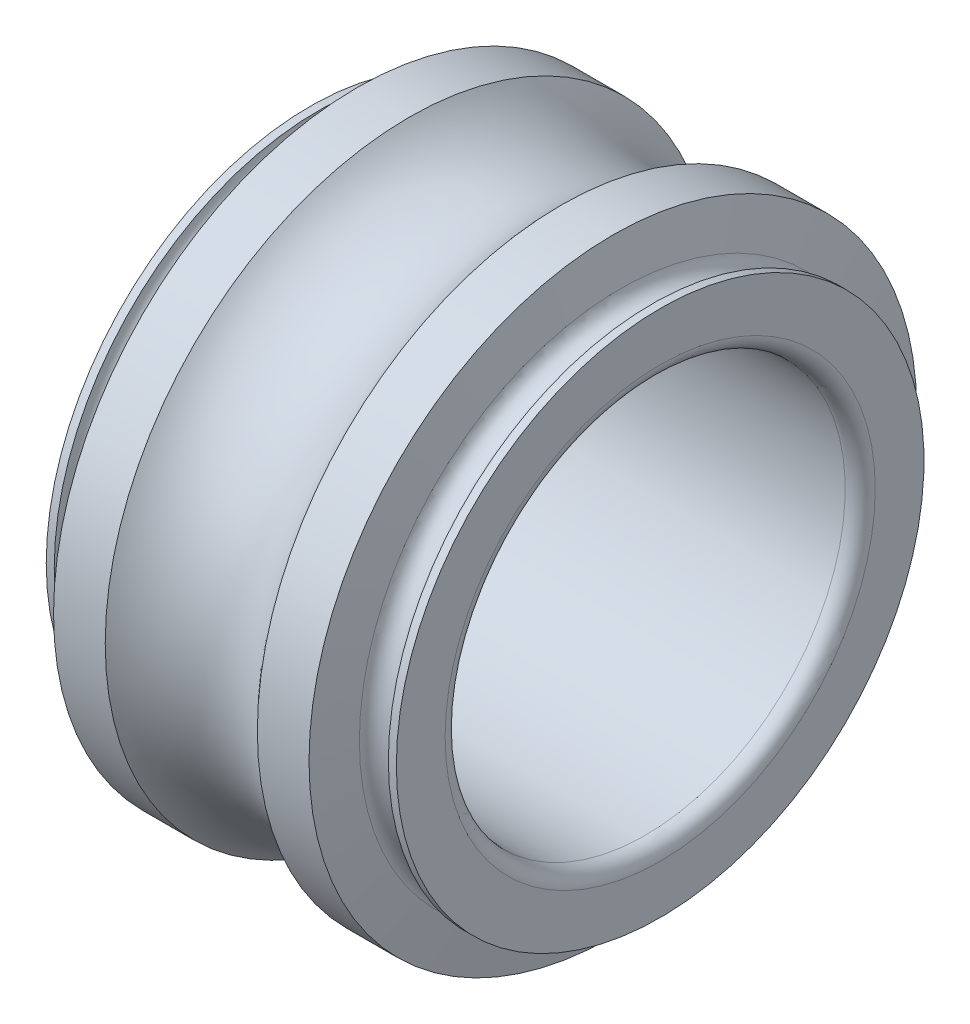
ISO-10303-21;
HEADER;
FILE_DESCRIPTION(('STEP AP214'),'2;1');
FILE_NAME('part.step','',(''),(''),'','','');
FILE_SCHEMA(('AUTOMOTIVE_DESIGN { 1 0 10303 214 1 1 1 1 }'));
ENDSEC;
DATA;
#1=APPLICATION_CONTEXT('core data for automotive mechanical design processes');
#2=APPLICATION_PROTOCOL_DEFINITION('international standard','automotive_design',2000,#1);
#3=PRODUCT_CONTEXT('',#1,'mechanical');
#4=PRODUCT('Part','Part','',(#3));
#5=PRODUCT_RELATED_PRODUCT_CATEGORY('part','',(#4));
#6=PRODUCT_DEFINITION_FORMATION('','',#4);
#7=PRODUCT_DEFINITION_CONTEXT('part definition',#1,'design');
#8=PRODUCT_DEFINITION('design','',#6,#7);
#9=PRODUCT_DEFINITION_SHAPE('','',#8);
#10=(LENGTH_UNIT() NAMED_UNIT(*) SI_UNIT(.MILLI.,.METRE.));
#11=(NAMED_UNIT(*) PLANE_ANGLE_UNIT() SI_UNIT($,.RADIAN.));
#12=(NAMED_UNIT(*) SI_UNIT($,.STERADIAN.) SOLID_ANGLE_UNIT());
#13=UNCERTAINTY_MEASURE_WITH_UNIT(LENGTH_MEASURE(1.E-05),#10,'distance_accuracy_value','');
#14=(GEOMETRIC_REPRESENTATION_CONTEXT(3) GLOBAL_UNCERTAINTY_ASSIGNED_CONTEXT((#13)) GLOBAL_UNIT_ASSIGNED_CONTEXT((#10,
#11,#12)) REPRESENTATION_CONTEXT('',''));
#15=CARTESIAN_POINT('',(0.,0.,0.));
#16=DIRECTION('',(0.,0.,1.));
#17=DIRECTION('',(1.,0.,0.));
#18=AXIS2_PLACEMENT_3D('',#15,#16,#17);
#19=CARTESIAN_POINT('',(3.5,0.,0.));
#20=DIRECTION('',(-1.,0.,0.));
#21=DIRECTION('',(0.,0.,1.));
#22=AXIS2_PLACEMENT_3D('',#19,#20,#21);
#23=TOROIDAL_SURFACE('',#22,7.35,1.9845);
#24=CARTESIAN_POINT('',(5.020728526069,0.,0.));
#25=DIRECTION('',(-1.,0.,0.));
#26=DIRECTION('',(0.,0.,1.));
#27=AXIS2_PLACEMENT_3D('',#24,#25,#26);
#28=CIRCLE('',#27,6.075);
#29=CARTESIAN_POINT('',(5.020728526069,0.,6.075));
#30=VERTEX_POINT('',#29);
#31=EDGE_CURVE('E79',#30,#30,#28,.T.);
#32=ORIENTED_EDGE('',*,*,#31,.T.);
#33=EDGE_LOOP('',(#32));
#34=FACE_BOUND('',#33,.T.);
#35=CARTESIAN_POINT('',(1.979271473931,0.,0.));
#36=DIRECTION('',(-1.,0.,0.));
#37=DIRECTION('',(0.,0.,1.));
#38=AXIS2_PLACEMENT_3D('',#35,#36,#37);
#39=CIRCLE('',#38,6.075);
#40=CARTESIAN_POINT('',(1.979271473931,0.,6.075));
#41=VERTEX_POINT('',#40);
#42=EDGE_CURVE('E10',#41,#41,#39,.T.);
#43=ORIENTED_EDGE('',*,*,#42,.F.);
#44=EDGE_LOOP('',(#43));
#45=FACE_BOUND('',#44,.T.);
#46=ADVANCED_FACE('F14',(#34,#45),#23,.F.);
#47=CARTESIAN_POINT('',(0.,0.,0.));
#48=DIRECTION('',(-1.,0.,0.));
#49=DIRECTION('',(0.,0.,1.));
#50=AXIS2_PLACEMENT_3D('',#47,#48,#49);
#51=CYLINDRICAL_SURFACE('',#50,6.075);
#52=ORIENTED_EDGE('',*,*,#42,.T.);
#53=EDGE_LOOP('',(#52));
#54=FACE_BOUND('',#53,.T.);
#55=CARTESIAN_POINT('',(0.945998100370209,0.,0.));
#56=DIRECTION('',(-1.,0.,0.));
#57=DIRECTION('',(0.,0.,1.));
#58=AXIS2_PLACEMENT_3D('',#55,#56,#57);
#59=CIRCLE('',#58,6.075);
#60=CARTESIAN_POINT('',(0.945998100370209,0.,6.075));
#61=VERTEX_POINT('',#60);
#62=EDGE_CURVE('E21',#61,#61,#59,.T.);
#63=ORIENTED_EDGE('',*,*,#62,.F.);
#64=EDGE_LOOP('',(#63));
#65=FACE_BOUND('',#64,.T.);
#66=ADVANCED_FACE('F100',(#54,#65),#51,.T.);
#67=CARTESIAN_POINT('',(0.945998100370209,0.,0.));
#68=DIRECTION('',(1.,0.,0.));
#69=DIRECTION('',(0.,0.,-1.));
#70=AXIS2_PLACEMENT_3D('',#67,#68,#69);
#71=CONICAL_SURFACE('',#70,6.075,1.39626340159546);
#72=CARTESIAN_POINT('',(0.795138480963905,0.,0.));
#73=DIRECTION('',(-1.,0.,0.));
#74=DIRECTION('',(0.,0.,1.));
#75=AXIS2_PLACEMENT_3D('',#72,#73,#74);
#76=CIRCLE('',#75,5.21943258314658);
#77=CARTESIAN_POINT('',(0.795138480963905,0.,5.21943258314658));
#78=VERTEX_POINT('',#77);
#79=EDGE_CURVE('E30',#78,#78,#76,.T.);
#80=ORIENTED_EDGE('',*,*,#79,.F.);
#81=EDGE_LOOP('',(#80));
#82=FACE_BOUND('',#81,.T.);
#83=ORIENTED_EDGE('',*,*,#62,.T.);
#84=EDGE_LOOP('',(#83));
#85=FACE_BOUND('',#84,.T.);
#86=ADVANCED_FACE('F104',(#82,#85),#71,.T.);
#87=CARTESIAN_POINT('',(0.48,0.,0.));
#88=DIRECTION('',(-1.,0.,0.));
#89=DIRECTION('',(0.,0.,1.));
#90=AXIS2_PLACEMENT_3D('',#87,#88,#89);
#91=TOROIDAL_SURFACE('',#90,5.275,0.32);
#92=ORIENTED_EDGE('',*,*,#79,.T.);
#93=EDGE_LOOP('',(#92));
#94=FACE_BOUND('',#93,.T.);
#95=CARTESIAN_POINT('',(0.16,0.,0.));
#96=DIRECTION('',(-1.,0.,0.));
#97=DIRECTION('',(0.,0.,1.));
#98=AXIS2_PLACEMENT_3D('',#95,#96,#97);
#99=CIRCLE('',#98,5.275);
#100=CARTESIAN_POINT('',(0.16,0.,5.275));
#101=VERTEX_POINT('',#100);
#102=EDGE_CURVE('E37',#101,#101,#99,.T.);
#103=ORIENTED_EDGE('',*,*,#102,.F.);
#104=EDGE_LOOP('',(#103));
#105=FACE_BOUND('',#104,.T.);
#106=ADVANCED_FACE('F108',(#94,#105),#91,.F.);
#107=CARTESIAN_POINT('',(0.,0.,0.));
#108=DIRECTION('',(-1.,0.,0.));
#109=DIRECTION('',(0.,0.,1.));
#110=AXIS2_PLACEMENT_3D('',#107,#108,#109);
#111=CYLINDRICAL_SURFACE('',#110,5.275);
#112=ORIENTED_EDGE('',*,*,#102,.T.);
#113=EDGE_LOOP('',(#112));
#114=FACE_BOUND('',#113,.T.);
#115=CARTESIAN_POINT('',(0.,0.,0.));
#116=DIRECTION('',(-1.,0.,0.));
#117=DIRECTION('',(0.,0.,1.));
#118=AXIS2_PLACEMENT_3D('',#115,#116,#117);
#119=CIRCLE('',#118,5.275);
#120=CARTESIAN_POINT('',(0.,0.,5.275));
#121=VERTEX_POINT('',#120);
#122=EDGE_CURVE('E43',#121,#121,#119,.T.);
#123=ORIENTED_EDGE('',*,*,#122,.F.);
#124=EDGE_LOOP('',(#123));
#125=FACE_BOUND('',#124,.T.);
#126=ADVANCED_FACE('F115',(#114,#125),#111,.T.);
#127=CARTESIAN_POINT('',(0.,4.3,0.));
#128=DIRECTION('',(-1.,0.,0.));
#129=DIRECTION('',(0.,0.,1.));
#130=AXIS2_PLACEMENT_3D('',#127,#128,#129);
#131=PLANE('',#130);
#132=ORIENTED_EDGE('',*,*,#122,.T.);
#133=EDGE_LOOP('',(#132));
#134=FACE_BOUND('',#133,.T.);
#135=CARTESIAN_POINT('',(0.,0.,0.));
#136=DIRECTION('',(-1.,0.,0.));
#137=DIRECTION('',(0.,0.,1.));
#138=AXIS2_PLACEMENT_3D('',#135,#136,#137);
#139=CIRCLE('',#138,4.3);
#140=CARTESIAN_POINT('',(0.,0.,4.3));
#141=VERTEX_POINT('',#140);
#142=EDGE_CURVE('E47',#141,#141,#139,.T.);
#143=ORIENTED_EDGE('',*,*,#142,.F.);
#144=EDGE_LOOP('',(#143));
#145=FACE_BOUND('',#144,.T.);
#146=ADVANCED_FACE('F119',(#134,#145),#131,.T.);
#147=CARTESIAN_POINT('',(0.3,0.,0.));
#148=DIRECTION('',(-1.,0.,0.));
#149=DIRECTION('',(0.,0.,1.));
#150=AXIS2_PLACEMENT_3D('',#147,#148,#149);
#151=TOROIDAL_SURFACE('',#150,4.3,0.3);
#152=CARTESIAN_POINT('',(0.3,0.,0.));
#153=DIRECTION('',(-1.,0.,0.));
#154=DIRECTION('',(0.,0.,1.));
#155=AXIS2_PLACEMENT_3D('',#152,#153,#154);
#156=CIRCLE('',#155,4.);
#157=CARTESIAN_POINT('',(0.3,0.,4.));
#158=VERTEX_POINT('',#157);
#159=EDGE_CURVE('E51',#158,#158,#156,.T.);
#160=ORIENTED_EDGE('',*,*,#159,.F.);
#161=EDGE_LOOP('',(#160));
#162=FACE_BOUND('',#161,.T.);
#163=ORIENTED_EDGE('',*,*,#142,.T.);
#164=EDGE_LOOP('',(#163));
#165=FACE_BOUND('',#164,.T.);
#166=ADVANCED_FACE('F123',(#162,#165),#151,.T.);
#167=CARTESIAN_POINT('',(0.,0.,0.));
#168=DIRECTION('',(-1.,0.,0.));
#169=DIRECTION('',(0.,0.,1.));
#170=AXIS2_PLACEMENT_3D('',#167,#168,#169);
#171=CYLINDRICAL_SURFACE('',#170,4.);
#172=CARTESIAN_POINT('',(6.7,0.,0.));
#173=DIRECTION('',(-1.,0.,0.));
#174=DIRECTION('',(0.,0.,1.));
#175=AXIS2_PLACEMENT_3D('',#172,#173,#174);
#176=CIRCLE('',#175,4.);
#177=CARTESIAN_POINT('',(6.7,0.,4.));
#178=VERTEX_POINT('',#177);
#179=EDGE_CURVE('E55',#178,#178,#176,.T.);
#180=ORIENTED_EDGE('',*,*,#179,.F.);
#181=EDGE_LOOP('',(#180));
#182=FACE_BOUND('',#181,.T.);
#183=ORIENTED_EDGE('',*,*,#159,.T.);
#184=EDGE_LOOP('',(#183));
#185=FACE_BOUND('',#184,.T.);
#186=ADVANCED_FACE('F127',(#182,#185),#171,.F.);
#187=CARTESIAN_POINT('',(6.7,0.,0.));
#188=DIRECTION('',(-1.,0.,0.));
#189=DIRECTION('',(0.,0.,1.));
#190=AXIS2_PLACEMENT_3D('',#187,#188,#189);
#191=TOROIDAL_SURFACE('',#190,4.3,0.3);
#192=CARTESIAN_POINT('',(7.,0.,0.));
#193=DIRECTION('',(-1.,0.,0.));
#194=DIRECTION('',(0.,0.,1.));
#195=AXIS2_PLACEMENT_3D('',#192,#193,#194);
#196=CIRCLE('',#195,4.3);
#197=CARTESIAN_POINT('',(7.,0.,4.3));
#198=VERTEX_POINT('',#197);
#199=EDGE_CURVE('E59',#198,#198,#196,.T.);
#200=ORIENTED_EDGE('',*,*,#199,.F.);
#201=EDGE_LOOP('',(#200));
#202=FACE_BOUND('',#201,.T.);
#203=ORIENTED_EDGE('',*,*,#179,.T.);
#204=EDGE_LOOP('',(#203));
#205=FACE_BOUND('',#204,.T.);
#206=ADVANCED_FACE('F131',(#202,#205),#191,.T.);
#207=CARTESIAN_POINT('',(7.,4.3,0.));
#208=DIRECTION('',(-1.,0.,0.));
#209=DIRECTION('',(0.,0.,1.));
#210=AXIS2_PLACEMENT_3D('',#207,#208,#209);
#211=PLANE('',#210);
#212=CARTESIAN_POINT('',(7.,0.,0.));
#213=DIRECTION('',(-1.,0.,0.));
#214=DIRECTION('',(0.,0.,1.));
#215=AXIS2_PLACEMENT_3D('',#212,#213,#214);
#216=CIRCLE('',#215,5.275);
#217=CARTESIAN_POINT('',(7.,0.,5.275));
#218=VERTEX_POINT('',#217);
#219=EDGE_CURVE('E63',#218,#218,#216,.T.);
#220=ORIENTED_EDGE('',*,*,#219,.F.);
#221=EDGE_LOOP('',(#220));
#222=FACE_BOUND('',#221,.T.);
#223=ORIENTED_EDGE('',*,*,#199,.T.);
#224=EDGE_LOOP('',(#223));
#225=FACE_BOUND('',#224,.T.);
#226=ADVANCED_FACE('F135',(#222,#225),#211,.F.);
#227=CARTESIAN_POINT('',(0.,0.,0.));
#228=DIRECTION('',(-1.,0.,0.));
#229=DIRECTION('',(0.,0.,1.));
#230=AXIS2_PLACEMENT_3D('',#227,#228,#229);
#231=CYLINDRICAL_SURFACE('',#230,5.275);
#232=CARTESIAN_POINT('',(6.84,0.,0.));
#233=DIRECTION('',(-1.,0.,0.));
#234=DIRECTION('',(0.,0.,1.));
#235=AXIS2_PLACEMENT_3D('',#232,#233,#234);
#236=CIRCLE('',#235,5.275);
#237=CARTESIAN_POINT('',(6.84,0.,5.275));
#238=VERTEX_POINT('',#237);
#239=EDGE_CURVE('E67',#238,#238,#236,.T.);
#240=ORIENTED_EDGE('',*,*,#239,.F.);
#241=EDGE_LOOP('',(#240));
#242=FACE_BOUND('',#241,.T.);
#243=ORIENTED_EDGE('',*,*,#219,.T.);
#244=EDGE_LOOP('',(#243));
#245=FACE_BOUND('',#244,.T.);
#246=ADVANCED_FACE('F139',(#242,#245),#231,.T.);
#247=CARTESIAN_POINT('',(6.52,0.,0.));
#248=DIRECTION('',(-1.,0.,0.));
#249=DIRECTION('',(0.,0.,1.));
#250=AXIS2_PLACEMENT_3D('',#247,#248,#249);
#251=TOROIDAL_SURFACE('',#250,5.275,0.32);
#252=ORIENTED_EDGE('',*,*,#239,.T.);
#253=EDGE_LOOP('',(#252));
#254=FACE_BOUND('',#253,.T.);
#255=CARTESIAN_POINT('',(6.20486151903609,0.,0.));
#256=DIRECTION('',(-1.,0.,0.));
#257=DIRECTION('',(0.,0.,1.));
#258=AXIS2_PLACEMENT_3D('',#255,#256,#257);
#259=CIRCLE('',#258,5.21943258314658);
#260=CARTESIAN_POINT('',(6.20486151903609,0.,5.21943258314658));
#261=VERTEX_POINT('',#260);
#262=EDGE_CURVE('E71',#261,#261,#259,.T.);
#263=ORIENTED_EDGE('',*,*,#262,.F.);
#264=EDGE_LOOP('',(#263));
#265=FACE_BOUND('',#264,.T.);
#266=ADVANCED_FACE('F96',(#254,#265),#251,.F.);
#267=CARTESIAN_POINT('',(6.05400189962979,0.,0.));
#268=DIRECTION('',(-1.,0.,0.));
#269=DIRECTION('',(0.,0.,1.));
#270=AXIS2_PLACEMENT_3D('',#267,#268,#269);
#271=CONICAL_SURFACE('',#270,6.075,1.39626340159546);
#272=ORIENTED_EDGE('',*,*,#262,.T.);
#273=EDGE_LOOP('',(#272));
#274=FACE_BOUND('',#273,.T.);
#275=CARTESIAN_POINT('',(6.05400189962979,0.,0.));
#276=DIRECTION('',(-1.,0.,0.));
#277=DIRECTION('',(0.,0.,1.));
#278=AXIS2_PLACEMENT_3D('',#275,#276,#277);
#279=CIRCLE('',#278,6.075);
#280=CARTESIAN_POINT('',(6.05400189962979,0.,6.075));
#281=VERTEX_POINT('',#280);
#282=EDGE_CURVE('E75',#281,#281,#279,.T.);
#283=ORIENTED_EDGE('',*,*,#282,.F.);
#284=EDGE_LOOP('',(#283));
#285=FACE_BOUND('',#284,.T.);
#286=ADVANCED_FACE('F89',(#274,#285),#271,.T.);
#287=CARTESIAN_POINT('',(0.,0.,0.));
#288=DIRECTION('',(-1.,0.,0.));
#289=DIRECTION('',(0.,0.,1.));
#290=AXIS2_PLACEMENT_3D('',#287,#288,#289);
#291=CYLINDRICAL_SURFACE('',#290,6.075);
#292=ORIENTED_EDGE('',*,*,#282,.T.);
#293=EDGE_LOOP('',(#292));
#294=FACE_BOUND('',#293,.T.);
#295=ORIENTED_EDGE('',*,*,#31,.F.);
#296=EDGE_LOOP('',(#295));
#297=FACE_BOUND('',#296,.T.);
#298=ADVANCED_FACE('F87',(#294,#297),#291,.T.);
#299=CLOSED_SHELL('',(#46,#66,#86,#106,#126,#146,#166,#186,#206,#226,#246,#266,#286,#298));
#300=MANIFOLD_SOLID_BREP('B1',#299);
#301=ADVANCED_BREP_SHAPE_REPRESENTATION('',(#18,#300),#14);
#302=SHAPE_DEFINITION_REPRESENTATION(#9,#301);
ENDSEC;
END-ISO-10303-21;
